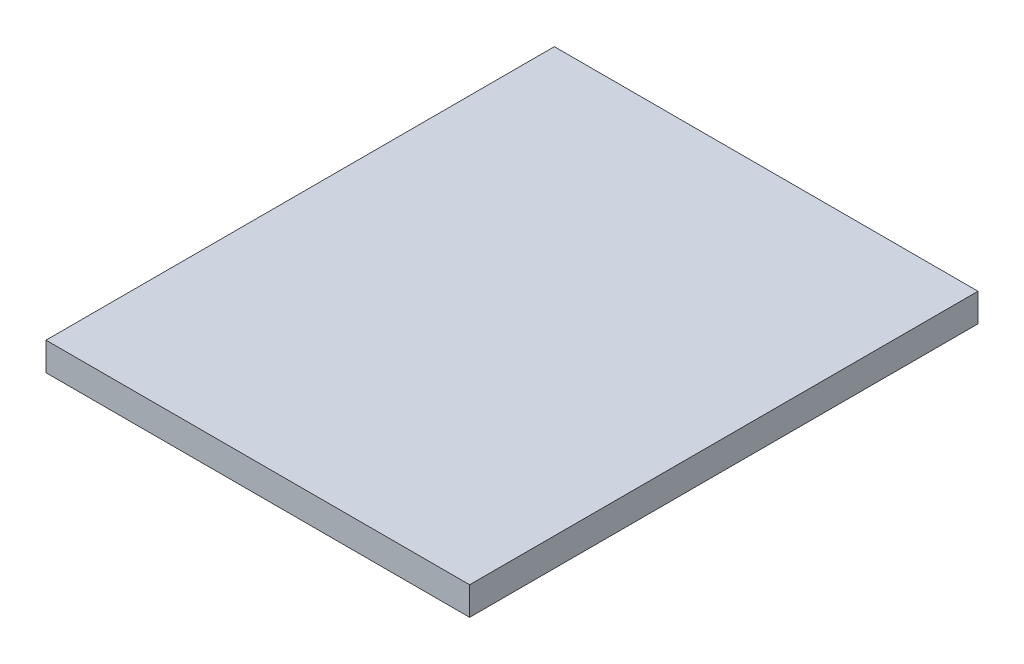
ISO-10303-21;
HEADER;
FILE_DESCRIPTION(('STEP AP214'),'2;1');
FILE_NAME('part.step','',(''),(''),'','','');
FILE_SCHEMA(('AUTOMOTIVE_DESIGN { 1 0 10303 214 1 1 1 1 }'));
ENDSEC;
DATA;
#1=APPLICATION_CONTEXT('core data for automotive mechanical design processes');
#2=APPLICATION_PROTOCOL_DEFINITION('international standard','automotive_design',2000,#1);
#3=PRODUCT_CONTEXT('',#1,'mechanical');
#4=PRODUCT('Part','Part','',(#3));
#5=PRODUCT_RELATED_PRODUCT_CATEGORY('part','',(#4));
#6=PRODUCT_DEFINITION_FORMATION('','',#4);
#7=PRODUCT_DEFINITION_CONTEXT('part definition',#1,'design');
#8=PRODUCT_DEFINITION('design','',#6,#7);
#9=PRODUCT_DEFINITION_SHAPE('','',#8);
#10=(LENGTH_UNIT() NAMED_UNIT(*) SI_UNIT(.MILLI.,.METRE.));
#11=(NAMED_UNIT(*) PLANE_ANGLE_UNIT() SI_UNIT($,.RADIAN.));
#12=(NAMED_UNIT(*) SI_UNIT($,.STERADIAN.) SOLID_ANGLE_UNIT());
#13=UNCERTAINTY_MEASURE_WITH_UNIT(LENGTH_MEASURE(1.E-05),#10,'distance_accuracy_value','');
#14=(GEOMETRIC_REPRESENTATION_CONTEXT(3) GLOBAL_UNCERTAINTY_ASSIGNED_CONTEXT((#13)) GLOBAL_UNIT_ASSIGNED_CONTEXT((#10,
#11,#12)) REPRESENTATION_CONTEXT('',''));
#15=CARTESIAN_POINT('',(0.,0.,0.));
#16=DIRECTION('',(0.,0.,1.));
#17=DIRECTION('',(1.,0.,0.));
#18=AXIS2_PLACEMENT_3D('',#15,#16,#17);
#19=CARTESIAN_POINT('',(47.625,3.175,57.15));
#20=DIRECTION('',(-1.,0.,0.));
#21=DIRECTION('',(0.,0.,1.));
#22=AXIS2_PLACEMENT_3D('',#19,#20,#21);
#23=PLANE('',#22);
#24=DIRECTION('',(0.,0.,-1.));
#25=VECTOR('',#24,1.);
#26=CARTESIAN_POINT('',(47.625,-3.175,57.15));
#27=LINE('',#26,#25);
#28=CARTESIAN_POINT('',(47.625,-3.175,57.15));
#29=VERTEX_POINT('',#28);
#30=CARTESIAN_POINT('',(47.625,-3.175,-57.15));
#31=VERTEX_POINT('',#30);
#32=EDGE_CURVE('E107',#29,#31,#27,.T.);
#33=ORIENTED_EDGE('',*,*,#32,.T.);
#34=DIRECTION('',(0.,-1.,0.));
#35=VECTOR('',#34,1.);
#36=CARTESIAN_POINT('',(47.625,3.175,-57.15));
#37=LINE('',#36,#35);
#38=CARTESIAN_POINT('',(47.625,3.175,-57.15));
#39=VERTEX_POINT('',#38);
#40=EDGE_CURVE('E11',#39,#31,#37,.T.);
#41=ORIENTED_EDGE('',*,*,#40,.F.);
#42=DIRECTION('',(0.,0.,-1.));
#43=VECTOR('',#42,1.);
#44=CARTESIAN_POINT('',(47.625,3.175,57.15));
#45=LINE('',#44,#43);
#46=CARTESIAN_POINT('',(47.625,3.175,57.15));
#47=VERTEX_POINT('',#46);
#48=EDGE_CURVE('E91',#47,#39,#45,.T.);
#49=ORIENTED_EDGE('',*,*,#48,.F.);
#50=DIRECTION('',(0.,-1.,0.));
#51=VECTOR('',#50,1.);
#52=CARTESIAN_POINT('',(47.625,3.175,57.15));
#53=LINE('',#52,#51);
#54=EDGE_CURVE('E103',#47,#29,#53,.T.);
#55=ORIENTED_EDGE('',*,*,#54,.T.);
#56=EDGE_LOOP('',(#33,#41,#49,#55));
#57=FACE_BOUND('',#56,.T.);
#58=ADVANCED_FACE('F39',(#57),#23,.F.);
#59=CARTESIAN_POINT('',(-47.625,3.175,-57.15));
#60=DIRECTION('',(0.,0.,1.));
#61=DIRECTION('',(1.,0.,0.));
#62=AXIS2_PLACEMENT_3D('',#59,#60,#61);
#63=PLANE('',#62);
#64=DIRECTION('',(-1.,0.,0.));
#65=VECTOR('',#64,1.);
#66=CARTESIAN_POINT('',(-47.625,-3.175,-57.15));
#67=LINE('',#66,#65);
#68=CARTESIAN_POINT('',(-47.625,-3.175,-57.15));
#69=VERTEX_POINT('',#68);
#70=EDGE_CURVE('E96',#31,#69,#67,.T.);
#71=ORIENTED_EDGE('',*,*,#70,.T.);
#72=DIRECTION('',(0.,-1.,0.));
#73=VECTOR('',#72,1.);
#74=CARTESIAN_POINT('',(-47.625,3.175,-57.15));
#75=LINE('',#74,#73);
#76=CARTESIAN_POINT('',(-47.625,3.175,-57.15));
#77=VERTEX_POINT('',#76);
#78=EDGE_CURVE('E48',#77,#69,#75,.T.);
#79=ORIENTED_EDGE('',*,*,#78,.F.);
#80=DIRECTION('',(-1.,0.,0.));
#81=VECTOR('',#80,1.);
#82=CARTESIAN_POINT('',(-47.625,3.175,-57.15));
#83=LINE('',#82,#81);
#84=EDGE_CURVE('E86',#39,#77,#83,.T.);
#85=ORIENTED_EDGE('',*,*,#84,.F.);
#86=ORIENTED_EDGE('',*,*,#40,.T.);
#87=EDGE_LOOP('',(#71,#79,#85,#86));
#88=FACE_BOUND('',#87,.T.);
#89=ADVANCED_FACE('F95',(#88),#63,.F.);
#90=CARTESIAN_POINT('',(-47.625,3.175,57.15));
#91=DIRECTION('',(1.,0.,0.));
#92=DIRECTION('',(0.,0.,-1.));
#93=AXIS2_PLACEMENT_3D('',#90,#91,#92);
#94=PLANE('',#93);
#95=DIRECTION('',(0.,0.,1.));
#96=VECTOR('',#95,1.);
#97=CARTESIAN_POINT('',(-47.625,-3.175,57.15));
#98=LINE('',#97,#96);
#99=CARTESIAN_POINT('',(-47.625,-3.175,57.15));
#100=VERTEX_POINT('',#99);
#101=EDGE_CURVE('E73',#69,#100,#98,.T.);
#102=ORIENTED_EDGE('',*,*,#101,.T.);
#103=DIRECTION('',(0.,-1.,0.));
#104=VECTOR('',#103,1.);
#105=CARTESIAN_POINT('',(-47.625,3.175,57.15));
#106=LINE('',#105,#104);
#107=CARTESIAN_POINT('',(-47.625,3.175,57.15));
#108=VERTEX_POINT('',#107);
#109=EDGE_CURVE('E98',#108,#100,#106,.T.);
#110=ORIENTED_EDGE('',*,*,#109,.F.);
#111=DIRECTION('',(0.,0.,1.));
#112=VECTOR('',#111,1.);
#113=CARTESIAN_POINT('',(-47.625,3.175,57.15));
#114=LINE('',#113,#112);
#115=EDGE_CURVE('E89',#77,#108,#114,.T.);
#116=ORIENTED_EDGE('',*,*,#115,.F.);
#117=ORIENTED_EDGE('',*,*,#78,.T.);
#118=EDGE_LOOP('',(#102,#110,#116,#117));
#119=FACE_BOUND('',#118,.T.);
#120=ADVANCED_FACE('F99',(#119),#94,.F.);
#121=CARTESIAN_POINT('',(-47.625,3.175,57.15));
#122=DIRECTION('',(0.,0.,-1.));
#123=DIRECTION('',(-1.,0.,0.));
#124=AXIS2_PLACEMENT_3D('',#121,#122,#123);
#125=PLANE('',#124);
#126=DIRECTION('',(1.,0.,0.));
#127=VECTOR('',#126,1.);
#128=CARTESIAN_POINT('',(-47.625,-3.175,57.15));
#129=LINE('',#128,#127);
#130=EDGE_CURVE('E79',#100,#29,#129,.T.);
#131=ORIENTED_EDGE('',*,*,#130,.T.);
#132=ORIENTED_EDGE('',*,*,#54,.F.);
#133=DIRECTION('',(1.,0.,0.));
#134=VECTOR('',#133,1.);
#135=CARTESIAN_POINT('',(-47.625,3.175,57.15));
#136=LINE('',#135,#134);
#137=EDGE_CURVE('E56',#108,#47,#136,.T.);
#138=ORIENTED_EDGE('',*,*,#137,.F.);
#139=ORIENTED_EDGE('',*,*,#109,.T.);
#140=EDGE_LOOP('',(#131,#132,#138,#139));
#141=FACE_BOUND('',#140,.T.);
#142=ADVANCED_FACE('F120',(#141),#125,.F.);
#143=CARTESIAN_POINT('',(0.,3.175,0.));
#144=DIRECTION('',(0.,-1.,0.));
#145=DIRECTION('',(0.,0.,-1.));
#146=AXIS2_PLACEMENT_3D('',#143,#144,#145);
#147=PLANE('',#146);
#148=ORIENTED_EDGE('',*,*,#48,.T.);
#149=ORIENTED_EDGE('',*,*,#84,.T.);
#150=ORIENTED_EDGE('',*,*,#115,.T.);
#151=ORIENTED_EDGE('',*,*,#137,.T.);
#152=EDGE_LOOP('',(#148,#149,#150,#151));
#153=FACE_BOUND('',#152,.T.);
#154=ADVANCED_FACE('F87',(#153),#147,.F.);
#155=CARTESIAN_POINT('',(0.,-3.175,0.));
#156=DIRECTION('',(0.,-1.,0.));
#157=DIRECTION('',(0.,0.,-1.));
#158=AXIS2_PLACEMENT_3D('',#155,#156,#157);
#159=PLANE('',#158);
#160=ORIENTED_EDGE('',*,*,#32,.F.);
#161=ORIENTED_EDGE('',*,*,#130,.F.);
#162=ORIENTED_EDGE('',*,*,#101,.F.);
#163=ORIENTED_EDGE('',*,*,#70,.F.);
#164=EDGE_LOOP('',(#160,#161,#162,#163));
#165=FACE_BOUND('',#164,.T.);
#166=ADVANCED_FACE('F123',(#165),#159,.T.);
#167=CLOSED_SHELL('',(#58,#89,#120,#142,#154,#166));
#168=MANIFOLD_SOLID_BREP('B2',#167);
#169=ADVANCED_BREP_SHAPE_REPRESENTATION('',(#18,#168),#14);
#170=SHAPE_DEFINITION_REPRESENTATION(#9,#169);
ENDSEC;
END-ISO-10303-21;
